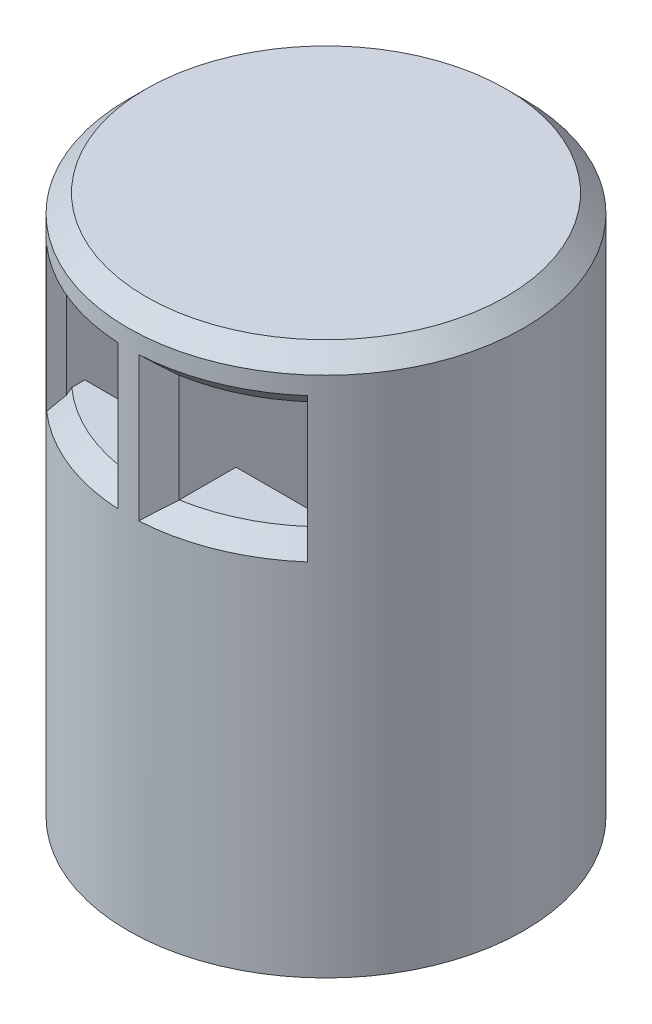
ISO-10303-21;
HEADER;
FILE_DESCRIPTION(('STEP AP214'),'2;1');
FILE_NAME('part.step','',(''),(''),'','','');
FILE_SCHEMA(('AUTOMOTIVE_DESIGN { 1 0 10303 214 1 1 1 1 }'));
ENDSEC;
DATA;
#1=APPLICATION_CONTEXT('core data for automotive mechanical design processes');
#2=APPLICATION_PROTOCOL_DEFINITION('international standard','automotive_design',2000,#1);
#3=PRODUCT_CONTEXT('',#1,'mechanical');
#4=PRODUCT('Part','Part','',(#3));
#5=PRODUCT_RELATED_PRODUCT_CATEGORY('part','',(#4));
#6=PRODUCT_DEFINITION_FORMATION('','',#4);
#7=PRODUCT_DEFINITION_CONTEXT('part definition',#1,'design');
#8=PRODUCT_DEFINITION('design','',#6,#7);
#9=PRODUCT_DEFINITION_SHAPE('','',#8);
#10=(LENGTH_UNIT() NAMED_UNIT(*) SI_UNIT(.MILLI.,.METRE.));
#11=(NAMED_UNIT(*) PLANE_ANGLE_UNIT() SI_UNIT($,.RADIAN.));
#12=(NAMED_UNIT(*) SI_UNIT($,.STERADIAN.) SOLID_ANGLE_UNIT());
#13=UNCERTAINTY_MEASURE_WITH_UNIT(LENGTH_MEASURE(1.E-05),#10,'distance_accuracy_value','');
#14=(GEOMETRIC_REPRESENTATION_CONTEXT(3) GLOBAL_UNCERTAINTY_ASSIGNED_CONTEXT((#13)) GLOBAL_UNIT_ASSIGNED_CONTEXT((#10,
#11,#12)) REPRESENTATION_CONTEXT('',''));
#15=CARTESIAN_POINT('',(0.,0.,0.));
#16=DIRECTION('',(0.,0.,1.));
#17=DIRECTION('',(1.,0.,0.));
#18=AXIS2_PLACEMENT_3D('',#15,#16,#17);
#19=CARTESIAN_POINT('',(0.,15.,0.));
#20=DIRECTION('',(0.,-1.,0.));
#21=DIRECTION('',(0.,0.,-1.));
#22=AXIS2_PLACEMENT_3D('',#19,#20,#21);
#23=CYLINDRICAL_SURFACE('',#22,5.5);
#24=CARTESIAN_POINT('',(0.,14.5,0.));
#25=DIRECTION('',(0.,1.,0.));
#26=DIRECTION('',(0.,0.,1.));
#27=AXIS2_PLACEMENT_3D('',#24,#25,#26);
#28=CIRCLE('',#27,5.5);
#29=CARTESIAN_POINT('',(0.,14.5,5.5));
#30=VERTEX_POINT('',#29);
#31=EDGE_CURVE('E11',#30,#30,#28,.F.);
#32=ORIENTED_EDGE('',*,*,#31,.T.);
#33=EDGE_LOOP('',(#32));
#34=FACE_BOUND('',#33,.T.);
#35=DIRECTION('',(0.,-1.,0.));
#36=VECTOR('',#35,1.);
#37=CARTESIAN_POINT('',(-3.62462466366027,15.,4.1366769329482));
#38=LINE('',#37,#36);
#39=CARTESIAN_POINT('',(-3.62462466366026,10.,4.1366769329482));
#40=VERTEX_POINT('',#39);
#41=CARTESIAN_POINT('',(-3.62462466366026,14.,4.1366769329482));
#42=VERTEX_POINT('',#41);
#43=EDGE_CURVE('E325',#40,#42,#38,.F.);
#44=ORIENTED_EDGE('',*,*,#43,.T.);
#45=CARTESIAN_POINT('',(0.,14.,0.));
#46=DIRECTION('',(0.,-1.,0.));
#47=DIRECTION('',(0.,0.,-1.));
#48=AXIS2_PLACEMENT_3D('',#45,#46,#47);
#49=CIRCLE('',#48,5.5);
#50=CARTESIAN_POINT('',(-0.291659907801685,14.,5.49226132828556));
#51=VERTEX_POINT('',#50);
#52=EDGE_CURVE('E328',#42,#51,#49,.F.);
#53=ORIENTED_EDGE('',*,*,#52,.T.);
#54=DIRECTION('',(0.,-1.,0.));
#55=VECTOR('',#54,1.);
#56=CARTESIAN_POINT('',(-0.291659907801685,15.,5.49226132828556));
#57=LINE('',#56,#55);
#58=CARTESIAN_POINT('',(-0.291659907801685,10.,5.49226132828556));
#59=VERTEX_POINT('',#58);
#60=EDGE_CURVE('E319',#51,#59,#57,.T.);
#61=ORIENTED_EDGE('',*,*,#60,.T.);
#62=CARTESIAN_POINT('',(0.,10.,0.));
#63=DIRECTION('',(0.,-1.,0.));
#64=DIRECTION('',(0.,0.,-1.));
#65=AXIS2_PLACEMENT_3D('',#62,#63,#64);
#66=CIRCLE('',#65,5.5);
#67=EDGE_CURVE('E322',#59,#40,#66,.T.);
#68=ORIENTED_EDGE('',*,*,#67,.T.);
#69=EDGE_LOOP('',(#44,#53,#61,#68));
#70=FACE_BOUND('',#69,.T.);
#71=DIRECTION('',(0.,-1.,0.));
#72=VECTOR('',#71,1.);
#73=CARTESIAN_POINT('',(0.291659907801685,15.,5.49226132828556));
#74=LINE('',#73,#72);
#75=CARTESIAN_POINT('',(0.291659907801685,10.,5.49226132828556));
#76=VERTEX_POINT('',#75);
#77=CARTESIAN_POINT('',(0.291659907801685,14.,5.49226132828556));
#78=VERTEX_POINT('',#77);
#79=EDGE_CURVE('E312',#76,#78,#74,.F.);
#80=ORIENTED_EDGE('',*,*,#79,.T.);
#81=CARTESIAN_POINT('',(0.,14.,0.));
#82=DIRECTION('',(0.,1.,0.));
#83=DIRECTION('',(0.,0.,1.));
#84=AXIS2_PLACEMENT_3D('',#81,#82,#83);
#85=CIRCLE('',#84,5.5);
#86=CARTESIAN_POINT('',(3.62462466366027,14.,4.13667693294819));
#87=VERTEX_POINT('',#86);
#88=EDGE_CURVE('E315',#78,#87,#85,.T.);
#89=ORIENTED_EDGE('',*,*,#88,.T.);
#90=DIRECTION('',(0.,-1.,0.));
#91=VECTOR('',#90,1.);
#92=CARTESIAN_POINT('',(3.62462466366027,15.,4.1366769329482));
#93=LINE('',#92,#91);
#94=CARTESIAN_POINT('',(3.62462466366027,10.,4.13667693294819));
#95=VERTEX_POINT('',#94);
#96=EDGE_CURVE('E309',#87,#95,#93,.T.);
#97=ORIENTED_EDGE('',*,*,#96,.T.);
#98=CARTESIAN_POINT('',(0.,10.,0.));
#99=DIRECTION('',(0.,-1.,0.));
#100=DIRECTION('',(0.,0.,-1.));
#101=AXIS2_PLACEMENT_3D('',#98,#99,#100);
#102=CIRCLE('',#101,5.5);
#103=EDGE_CURVE('E306',#95,#76,#102,.T.);
#104=ORIENTED_EDGE('',*,*,#103,.T.);
#105=EDGE_LOOP('',(#80,#89,#97,#104));
#106=FACE_BOUND('',#105,.T.);
#107=CARTESIAN_POINT('',(0.,0.,0.));
#108=DIRECTION('',(0.,1.,0.));
#109=DIRECTION('',(0.,0.,1.));
#110=AXIS2_PLACEMENT_3D('',#107,#108,#109);
#111=CIRCLE('',#110,5.5);
#112=CARTESIAN_POINT('',(0.,0.,5.5));
#113=VERTEX_POINT('',#112);
#114=EDGE_CURVE('E277',#113,#113,#111,.T.);
#115=ORIENTED_EDGE('',*,*,#114,.T.);
#116=EDGE_LOOP('',(#115));
#117=FACE_BOUND('',#116,.T.);
#118=ADVANCED_FACE('F41',(#34,#70,#106,#117),#23,.T.);
#119=CARTESIAN_POINT('',(0.,15.,0.));
#120=DIRECTION('',(0.,1.,0.));
#121=DIRECTION('',(0.,0.,1.));
#122=AXIS2_PLACEMENT_3D('',#119,#120,#121);
#123=PLANE('',#122);
#124=CARTESIAN_POINT('',(0.,15.,0.));
#125=DIRECTION('',(0.,1.,0.));
#126=DIRECTION('',(0.,0.,1.));
#127=AXIS2_PLACEMENT_3D('',#124,#125,#126);
#128=CIRCLE('',#127,5.);
#129=CARTESIAN_POINT('',(0.,15.,5.));
#130=VERTEX_POINT('',#129);
#131=EDGE_CURVE('E51',#130,#130,#128,.T.);
#132=ORIENTED_EDGE('',*,*,#131,.T.);
#133=EDGE_LOOP('',(#132));
#134=FACE_BOUND('',#133,.T.);
#135=ADVANCED_FACE('F592',(#134),#123,.T.);
#136=CARTESIAN_POINT('',(0.,0.,0.));
#137=DIRECTION('',(0.,1.,0.));
#138=DIRECTION('',(0.,0.,1.));
#139=AXIS2_PLACEMENT_3D('',#136,#137,#138);
#140=PLANE('',#139);
#141=DIRECTION('',(0.,0.,-1.));
#142=VECTOR('',#141,1.);
#143=CARTESIAN_POINT('',(3.85,0.,0.));
#144=LINE('',#143,#142);
#145=CARTESIAN_POINT('',(3.85,0.,3.85));
#146=VERTEX_POINT('',#145);
#147=CARTESIAN_POINT('',(3.85,0.,-3.85));
#148=VERTEX_POINT('',#147);
#149=EDGE_CURVE('E366',#146,#148,#144,.T.);
#150=ORIENTED_EDGE('',*,*,#149,.T.);
#151=DIRECTION('',(-1.,0.,0.));
#152=VECTOR('',#151,1.);
#153=CARTESIAN_POINT('',(0.,0.,-3.85));
#154=LINE('',#153,#152);
#155=CARTESIAN_POINT('',(-3.85,0.,-3.85));
#156=VERTEX_POINT('',#155);
#157=EDGE_CURVE('E369',#148,#156,#154,.T.);
#158=ORIENTED_EDGE('',*,*,#157,.T.);
#159=DIRECTION('',(0.,0.,1.));
#160=VECTOR('',#159,1.);
#161=CARTESIAN_POINT('',(-3.85,0.,0.));
#162=LINE('',#161,#160);
#163=CARTESIAN_POINT('',(-3.85,0.,3.85));
#164=VERTEX_POINT('',#163);
#165=EDGE_CURVE('E360',#156,#164,#162,.T.);
#166=ORIENTED_EDGE('',*,*,#165,.T.);
#167=DIRECTION('',(1.,0.,0.));
#168=VECTOR('',#167,1.);
#169=CARTESIAN_POINT('',(0.,0.,3.85));
#170=LINE('',#169,#168);
#171=EDGE_CURVE('E363',#164,#146,#170,.T.);
#172=ORIENTED_EDGE('',*,*,#171,.T.);
#173=EDGE_LOOP('',(#150,#158,#166,#172));
#174=FACE_BOUND('',#173,.T.);
#175=ORIENTED_EDGE('',*,*,#114,.F.);
#176=EDGE_LOOP('',(#175));
#177=FACE_BOUND('',#176,.T.);
#178=ADVANCED_FACE('F590',(#174,#177),#140,.F.);
#179=CARTESIAN_POINT('',(3.35,3.5,3.35));
#180=DIRECTION('',(1.,0.,0.));
#181=DIRECTION('',(0.,0.,-1.));
#182=AXIS2_PLACEMENT_3D('',#179,#180,#181);
#183=PLANE('',#182);
#184=DIRECTION('',(0.,0.,-1.));
#185=VECTOR('',#184,1.);
#186=CARTESIAN_POINT('',(3.35,10.5,5.5));
#187=LINE('',#186,#185);
#188=CARTESIAN_POINT('',(3.35,10.5,3.71180549059349));
#189=VERTEX_POINT('',#188);
#190=CARTESIAN_POINT('',(3.35,10.5,3.35));
#191=VERTEX_POINT('',#190);
#192=EDGE_CURVE('E635',#189,#191,#187,.T.);
#193=ORIENTED_EDGE('',*,*,#192,.F.);
#194=CARTESIAN_POINT('',(3.35,10.5,3.71180549059349));
#195=CARTESIAN_POINT('',(3.35,10.481349898815,3.73692500065102));
#196=CARTESIAN_POINT('',(3.35,10.462647472215,3.76200532117745));
#197=CARTESIAN_POINT('',(3.35,10.4251379700077,3.81208758073464));
#198=CARTESIAN_POINT('',(3.35,10.4063308944104,3.83708951977303));
#199=CARTESIAN_POINT('',(3.35,10.3874714934084,3.86205226928793));
#200=B_SPLINE_CURVE_WITH_KNOTS('',3,(#194,#195,#196,#197,#198,#199),.UNSPECIFIED.,.F.,.F.,(4,2,
4),(0.,0.0938574938186801,0.187714978516446),.UNSPECIFIED.);
#201=CARTESIAN_POINT('',(3.35,10.3874714934084,3.86205226928793));
#202=VERTEX_POINT('',#201);
#203=EDGE_CURVE('E536',#189,#202,#200,.T.);
#204=ORIENTED_EDGE('',*,*,#203,.T.);
#205=DIRECTION('',(0.,1.,0.));
#206=VECTOR('',#205,1.);
#207=CARTESIAN_POINT('',(3.35,3.5,3.86205226928793));
#208=LINE('',#207,#206);
#209=CARTESIAN_POINT('',(3.35,13.6125285065916,3.86205226928793));
#210=VERTEX_POINT('',#209);
#211=EDGE_CURVE('E58',#202,#210,#208,.T.);
#212=ORIENTED_EDGE('',*,*,#211,.T.);
#213=CARTESIAN_POINT('',(3.35,13.6125285065916,3.86205226928793));
#214=CARTESIAN_POINT('',(3.35,13.5936691055896,3.83708951977303));
#215=CARTESIAN_POINT('',(3.35,13.5748620299923,3.81208758073464));
#216=CARTESIAN_POINT('',(3.35,13.537352527785,3.76200532117745));
#217=CARTESIAN_POINT('',(3.35,13.518650101185,3.73692500065102));
#218=CARTESIAN_POINT('',(3.35,13.5,3.71180549059349));
#219=B_SPLINE_CURVE_WITH_KNOTS('',3,(#213,#214,#215,#216,#217,#218),.UNSPECIFIED.,.F.,.F.,(4,2,
4),(0.,0.0938574846977647,0.187714978516443),.UNSPECIFIED.);
#220=CARTESIAN_POINT('',(3.35,13.5,3.71180549059349));
#221=VERTEX_POINT('',#220);
#222=EDGE_CURVE('E581',#210,#221,#219,.T.);
#223=ORIENTED_EDGE('',*,*,#222,.T.);
#224=DIRECTION('',(0.,0.,1.));
#225=VECTOR('',#224,1.);
#226=CARTESIAN_POINT('',(3.35,13.5,-3.35));
#227=LINE('',#226,#225);
#228=CARTESIAN_POINT('',(3.35,13.5,-3.35));
#229=VERTEX_POINT('',#228);
#230=EDGE_CURVE('E256',#229,#221,#227,.T.);
#231=ORIENTED_EDGE('',*,*,#230,.F.);
#232=DIRECTION('',(0.,-1.,0.));
#233=VECTOR('',#232,1.);
#234=CARTESIAN_POINT('',(3.35,3.5,-3.35));
#235=LINE('',#234,#233);
#236=CARTESIAN_POINT('',(3.35,0.499999999999997,-3.35));
#237=VERTEX_POINT('',#236);
#238=EDGE_CURVE('E273',#229,#237,#235,.T.);
#239=ORIENTED_EDGE('',*,*,#238,.T.);
#240=DIRECTION('',(0.,0.,1.));
#241=VECTOR('',#240,1.);
#242=CARTESIAN_POINT('',(3.35,0.499999999999997,3.35));
#243=LINE('',#242,#241);
#244=CARTESIAN_POINT('',(3.35,0.499999999999997,3.35));
#245=VERTEX_POINT('',#244);
#246=EDGE_CURVE('E348',#237,#245,#243,.T.);
#247=ORIENTED_EDGE('',*,*,#246,.T.);
#248=DIRECTION('',(0.,-1.,0.));
#249=VECTOR('',#248,1.);
#250=CARTESIAN_POINT('',(3.35,3.5,3.35));
#251=LINE('',#250,#249);
#252=EDGE_CURVE('E272',#191,#245,#251,.T.);
#253=ORIENTED_EDGE('',*,*,#252,.F.);
#254=EDGE_LOOP('',(#193,#204,#212,#223,#231,#239,#247,#253));
#255=FACE_BOUND('',#254,.T.);
#256=ADVANCED_FACE('F561',(#255),#183,.F.);
#257=CARTESIAN_POINT('',(-3.35,3.5,-3.35));
#258=DIRECTION('',(0.,0.,-1.));
#259=DIRECTION('',(-1.,0.,0.));
#260=AXIS2_PLACEMENT_3D('',#257,#258,#259);
#261=PLANE('',#260);
#262=DIRECTION('',(0.,-1.,0.));
#263=VECTOR('',#262,1.);
#264=CARTESIAN_POINT('',(-3.35,3.5,-3.35));
#265=LINE('',#264,#263);
#266=CARTESIAN_POINT('',(-3.35,13.5,-3.35));
#267=VERTEX_POINT('',#266);
#268=CARTESIAN_POINT('',(-3.35,0.499999999999997,-3.35));
#269=VERTEX_POINT('',#268);
#270=EDGE_CURVE('E278',#267,#269,#265,.T.);
#271=ORIENTED_EDGE('',*,*,#270,.T.);
#272=DIRECTION('',(1.,0.,0.));
#273=VECTOR('',#272,1.);
#274=CARTESIAN_POINT('',(-3.35,0.499999999999997,-3.35));
#275=LINE('',#274,#273);
#276=EDGE_CURVE('E356',#269,#237,#275,.T.);
#277=ORIENTED_EDGE('',*,*,#276,.T.);
#278=ORIENTED_EDGE('',*,*,#238,.F.);
#279=DIRECTION('',(1.,0.,0.));
#280=VECTOR('',#279,1.);
#281=CARTESIAN_POINT('',(0.85,13.5,-3.35));
#282=LINE('',#281,#280);
#283=CARTESIAN_POINT('',(0.85,13.5,-3.35));
#284=VERTEX_POINT('',#283);
#285=EDGE_CURVE('E252',#284,#229,#282,.T.);
#286=ORIENTED_EDGE('',*,*,#285,.F.);
#287=DIRECTION('',(0.,-1.,0.));
#288=VECTOR('',#287,1.);
#289=CARTESIAN_POINT('',(0.85,13.5,-3.35));
#290=LINE('',#289,#288);
#291=CARTESIAN_POINT('',(0.85,4.,-3.35));
#292=VERTEX_POINT('',#291);
#293=EDGE_CURVE('E260',#284,#292,#290,.T.);
#294=ORIENTED_EDGE('',*,*,#293,.T.);
#295=DIRECTION('',(-0.70710678118655,-0.707106781186545,0.));
#296=VECTOR('',#295,1.);
#297=CARTESIAN_POINT('',(-1.50000000000001,1.65,-3.35));
#298=LINE('',#297,#296);
#299=CARTESIAN_POINT('',(0.349999999999999,3.5,-3.35));
#300=VERTEX_POINT('',#299);
#301=EDGE_CURVE('E382',#292,#300,#298,.T.);
#302=ORIENTED_EDGE('',*,*,#301,.T.);
#303=DIRECTION('',(1.,0.,0.));
#304=VECTOR('',#303,1.);
#305=CARTESIAN_POINT('',(-3.35,3.5,-3.35));
#306=LINE('',#305,#304);
#307=CARTESIAN_POINT('',(-0.349999999999999,3.5,-3.35));
#308=VERTEX_POINT('',#307);
#309=EDGE_CURVE('E242',#308,#300,#306,.T.);
#310=ORIENTED_EDGE('',*,*,#309,.F.);
#311=DIRECTION('',(-0.70710678118655,0.707106781186545,0.));
#312=VECTOR('',#311,1.);
#313=CARTESIAN_POINT('',(-1.85000000000001,5.,-3.35));
#314=LINE('',#313,#312);
#315=CARTESIAN_POINT('',(-0.849999999999999,4.,-3.35));
#316=VERTEX_POINT('',#315);
#317=EDGE_CURVE('E379',#308,#316,#314,.T.);
#318=ORIENTED_EDGE('',*,*,#317,.T.);
#319=DIRECTION('',(0.,-1.,0.));
#320=VECTOR('',#319,1.);
#321=CARTESIAN_POINT('',(-0.849999999999999,13.5,-3.35));
#322=LINE('',#321,#320);
#323=CARTESIAN_POINT('',(-0.849999999999999,13.5,-3.35));
#324=VERTEX_POINT('',#323);
#325=EDGE_CURVE('E237',#324,#316,#322,.T.);
#326=ORIENTED_EDGE('',*,*,#325,.F.);
#327=DIRECTION('',(1.,0.,0.));
#328=VECTOR('',#327,1.);
#329=CARTESIAN_POINT('',(-3.35,13.5,-3.35));
#330=LINE('',#329,#328);
#331=EDGE_CURVE('E627',#267,#324,#330,.T.);
#332=ORIENTED_EDGE('',*,*,#331,.F.);
#333=EDGE_LOOP('',(#271,#277,#278,#286,#294,#302,#310,#318,#326,#332));
#334=FACE_BOUND('',#333,.T.);
#335=ADVANCED_FACE('F558',(#334),#261,.F.);
#336=CARTESIAN_POINT('',(-3.35,3.5,3.35));
#337=DIRECTION('',(-1.,0.,0.));
#338=DIRECTION('',(0.,0.,1.));
#339=AXIS2_PLACEMENT_3D('',#336,#337,#338);
#340=PLANE('',#339);
#341=CARTESIAN_POINT('',(-3.35,13.5,3.71180549059349));
#342=CARTESIAN_POINT('',(-3.35,13.518650101185,3.73692500065102));
#343=CARTESIAN_POINT('',(-3.35,13.537352527785,3.76200532117745));
#344=CARTESIAN_POINT('',(-3.35,13.5748620299923,3.81208758073465));
#345=CARTESIAN_POINT('',(-3.35,13.5936691055896,3.83708951977303));
#346=CARTESIAN_POINT('',(-3.35,13.6125285065916,3.86205226928793));
#347=B_SPLINE_CURVE_WITH_KNOTS('',3,(#341,#342,#343,#344,#345,#346),.UNSPECIFIED.,.F.,.F.,(4,2,
4),(0.,0.0938574938186814,0.18771497851645),.UNSPECIFIED.);
#348=CARTESIAN_POINT('',(-3.35,13.5,3.71180549059349));
#349=VERTEX_POINT('',#348);
#350=CARTESIAN_POINT('',(-3.35,13.6125285065916,3.86205226928793));
#351=VERTEX_POINT('',#350);
#352=EDGE_CURVE('E397',#349,#351,#347,.T.);
#353=ORIENTED_EDGE('',*,*,#352,.T.);
#354=DIRECTION('',(0.,-1.,0.));
#355=VECTOR('',#354,1.);
#356=CARTESIAN_POINT('',(-3.35,3.5,3.86205226928793));
#357=LINE('',#356,#355);
#358=CARTESIAN_POINT('',(-3.35,10.3874714934084,3.86205226928793));
#359=VERTEX_POINT('',#358);
#360=EDGE_CURVE('E339',#351,#359,#357,.T.);
#361=ORIENTED_EDGE('',*,*,#360,.T.);
#362=CARTESIAN_POINT('',(-3.35,10.3874714934084,3.86205226928793));
#363=CARTESIAN_POINT('',(-3.35,10.4063308944104,3.83708951977303));
#364=CARTESIAN_POINT('',(-3.35,10.4251379700076,3.81208758073465));
#365=CARTESIAN_POINT('',(-3.35,10.462647472215,3.76200532117745));
#366=CARTESIAN_POINT('',(-3.35,10.481349898815,3.73692500065102));
#367=CARTESIAN_POINT('',(-3.35,10.5,3.71180549059349));
#368=B_SPLINE_CURVE_WITH_KNOTS('',3,(#362,#363,#364,#365,#366,#367),.UNSPECIFIED.,.F.,.F.,(4,2,
4),(0.,0.0938574846977709,0.187714978516455),.UNSPECIFIED.);
#369=CARTESIAN_POINT('',(-3.35,10.5,3.71180549059349));
#370=VERTEX_POINT('',#369);
#371=EDGE_CURVE('E568',#359,#370,#368,.T.);
#372=ORIENTED_EDGE('',*,*,#371,.T.);
#373=DIRECTION('',(0.,0.,-1.));
#374=VECTOR('',#373,1.);
#375=CARTESIAN_POINT('',(-3.35,10.5,5.5));
#376=LINE('',#375,#374);
#377=CARTESIAN_POINT('',(-3.35,10.5,3.35));
#378=VERTEX_POINT('',#377);
#379=EDGE_CURVE('E218',#370,#378,#376,.T.);
#380=ORIENTED_EDGE('',*,*,#379,.T.);
#381=DIRECTION('',(0.,-1.,0.));
#382=VECTOR('',#381,1.);
#383=CARTESIAN_POINT('',(-3.35,3.5,3.35));
#384=LINE('',#383,#382);
#385=CARTESIAN_POINT('',(-3.35,0.499999999999997,3.35));
#386=VERTEX_POINT('',#385);
#387=EDGE_CURVE('E226',#378,#386,#384,.T.);
#388=ORIENTED_EDGE('',*,*,#387,.T.);
#389=DIRECTION('',(0.,0.,-1.));
#390=VECTOR('',#389,1.);
#391=CARTESIAN_POINT('',(-3.35,0.499999999999997,3.35));
#392=LINE('',#391,#390);
#393=EDGE_CURVE('E336',#386,#269,#392,.T.);
#394=ORIENTED_EDGE('',*,*,#393,.T.);
#395=ORIENTED_EDGE('',*,*,#270,.F.);
#396=DIRECTION('',(0.,0.,-1.));
#397=VECTOR('',#396,1.);
#398=CARTESIAN_POINT('',(-3.35,13.5,3.35));
#399=LINE('',#398,#397);
#400=EDGE_CURVE('E265',#349,#267,#399,.T.);
#401=ORIENTED_EDGE('',*,*,#400,.F.);
#402=EDGE_LOOP('',(#353,#361,#372,#380,#388,#394,#395,#401));
#403=FACE_BOUND('',#402,.T.);
#404=ADVANCED_FACE('F560',(#403),#340,.F.);
#405=CARTESIAN_POINT('',(-3.35,3.5,3.35));
#406=DIRECTION('',(0.,0.,1.));
#407=DIRECTION('',(1.,0.,0.));
#408=AXIS2_PLACEMENT_3D('',#405,#406,#407);
#409=PLANE('',#408);
#410=ORIENTED_EDGE('',*,*,#252,.T.);
#411=DIRECTION('',(-1.,0.,0.));
#412=VECTOR('',#411,1.);
#413=CARTESIAN_POINT('',(-3.35,0.499999999999997,3.35));
#414=LINE('',#413,#412);
#415=EDGE_CURVE('E373',#245,#386,#414,.T.);
#416=ORIENTED_EDGE('',*,*,#415,.T.);
#417=ORIENTED_EDGE('',*,*,#387,.F.);
#418=DIRECTION('',(-1.,0.,0.));
#419=VECTOR('',#418,1.);
#420=CARTESIAN_POINT('',(-3.35,10.5,3.35));
#421=LINE('',#420,#419);
#422=CARTESIAN_POINT('',(-0.85,10.5,3.35));
#423=VERTEX_POINT('',#422);
#424=EDGE_CURVE('E209',#423,#378,#421,.T.);
#425=ORIENTED_EDGE('',*,*,#424,.F.);
#426=DIRECTION('',(0.,-1.,0.));
#427=VECTOR('',#426,1.);
#428=CARTESIAN_POINT('',(-0.85,13.5,3.35));
#429=LINE('',#428,#427);
#430=CARTESIAN_POINT('',(-0.85,4.,3.35));
#431=VERTEX_POINT('',#430);
#432=EDGE_CURVE('E224',#423,#431,#429,.T.);
#433=ORIENTED_EDGE('',*,*,#432,.T.);
#434=DIRECTION('',(0.70710678118655,-0.707106781186545,0.));
#435=VECTOR('',#434,1.);
#436=CARTESIAN_POINT('',(-1.85000000000001,5.,3.35));
#437=LINE('',#436,#435);
#438=CARTESIAN_POINT('',(-0.35,3.5,3.35));
#439=VERTEX_POINT('',#438);
#440=EDGE_CURVE('E376',#431,#439,#437,.T.);
#441=ORIENTED_EDGE('',*,*,#440,.T.);
#442=DIRECTION('',(-1.,0.,0.));
#443=VECTOR('',#442,1.);
#444=CARTESIAN_POINT('',(-3.35,3.5,3.35));
#445=LINE('',#444,#443);
#446=CARTESIAN_POINT('',(0.35,3.5,3.35));
#447=VERTEX_POINT('',#446);
#448=EDGE_CURVE('E236',#447,#439,#445,.T.);
#449=ORIENTED_EDGE('',*,*,#448,.F.);
#450=DIRECTION('',(0.70710678118655,0.707106781186545,0.));
#451=VECTOR('',#450,1.);
#452=CARTESIAN_POINT('',(-1.50000000000001,1.65,3.35));
#453=LINE('',#452,#451);
#454=CARTESIAN_POINT('',(0.85,4.,3.35));
#455=VERTEX_POINT('',#454);
#456=EDGE_CURVE('E385',#447,#455,#453,.T.);
#457=ORIENTED_EDGE('',*,*,#456,.T.);
#458=DIRECTION('',(0.,-1.,0.));
#459=VECTOR('',#458,1.);
#460=CARTESIAN_POINT('',(0.85,13.5,3.35));
#461=LINE('',#460,#459);
#462=CARTESIAN_POINT('',(0.85,10.5,3.35));
#463=VERTEX_POINT('',#462);
#464=EDGE_CURVE('E261',#463,#455,#461,.T.);
#465=ORIENTED_EDGE('',*,*,#464,.F.);
#466=DIRECTION('',(-1.,0.,0.));
#467=VECTOR('',#466,1.);
#468=CARTESIAN_POINT('',(3.35,10.5,3.35));
#469=LINE('',#468,#467);
#470=EDGE_CURVE('E471',#191,#463,#469,.T.);
#471=ORIENTED_EDGE('',*,*,#470,.F.);
#472=EDGE_LOOP('',(#410,#416,#417,#425,#433,#441,#449,#457,#465,#471));
#473=FACE_BOUND('',#472,.T.);
#474=ADVANCED_FACE('F223',(#473),#409,.F.);
#475=CARTESIAN_POINT('',(0.,3.5,0.));
#476=DIRECTION('',(0.,-1.,0.));
#477=DIRECTION('',(0.,0.,-1.));
#478=AXIS2_PLACEMENT_3D('',#475,#476,#477);
#479=PLANE('',#478);
#480=ORIENTED_EDGE('',*,*,#448,.T.);
#481=DIRECTION('',(0.,0.,-1.));
#482=VECTOR('',#481,1.);
#483=CARTESIAN_POINT('',(-0.349999999999999,3.5,-3.35));
#484=LINE('',#483,#482);
#485=EDGE_CURVE('E297',#439,#308,#484,.T.);
#486=ORIENTED_EDGE('',*,*,#485,.T.);
#487=ORIENTED_EDGE('',*,*,#309,.T.);
#488=DIRECTION('',(0.,0.,1.));
#489=VECTOR('',#488,1.);
#490=CARTESIAN_POINT('',(0.35,3.5,3.35));
#491=LINE('',#490,#489);
#492=EDGE_CURVE('E294',#300,#447,#491,.T.);
#493=ORIENTED_EDGE('',*,*,#492,.T.);
#494=EDGE_LOOP('',(#480,#486,#487,#493));
#495=FACE_BOUND('',#494,.T.);
#496=ADVANCED_FACE('F553',(#495),#479,.T.);
#497=CARTESIAN_POINT('',(0.85,13.5,-3.35));
#498=DIRECTION('',(-1.,0.,0.));
#499=DIRECTION('',(0.,0.,1.));
#500=AXIS2_PLACEMENT_3D('',#497,#498,#499);
#501=PLANE('',#500);
#502=ORIENTED_EDGE('',*,*,#464,.T.);
#503=DIRECTION('',(0.,0.,-1.));
#504=VECTOR('',#503,1.);
#505=CARTESIAN_POINT('',(0.85,4.,-3.35));
#506=LINE('',#505,#504);
#507=EDGE_CURVE('E302',#455,#292,#506,.T.);
#508=ORIENTED_EDGE('',*,*,#507,.T.);
#509=ORIENTED_EDGE('',*,*,#293,.F.);
#510=DIRECTION('',(0.,0.,-1.));
#511=VECTOR('',#510,1.);
#512=CARTESIAN_POINT('',(0.85,13.5,-3.35));
#513=LINE('',#512,#511);
#514=CARTESIAN_POINT('',(0.85,13.5,4.92722031169705));
#515=VERTEX_POINT('',#514);
#516=EDGE_CURVE('E249',#515,#284,#513,.T.);
#517=ORIENTED_EDGE('',*,*,#516,.F.);
#518=CARTESIAN_POINT('',(0.85,13.5,4.92722031169705));
#519=CARTESIAN_POINT('',(0.85,13.5011005750076,4.9283371432202));
#520=CARTESIAN_POINT('',(0.85,13.5022011554905,4.92945396934762));
#521=CARTESIAN_POINT('',(0.85,13.5044023274069,4.93168761081102));
#522=CARTESIAN_POINT('',(0.85,13.5055029188404,4.93280442614699));
#523=CARTESIAN_POINT('',(0.85,13.5066035157492,4.93392123608725));
#524=B_SPLINE_CURVE_WITH_KNOTS('',3,(#518,#519,#520,#521,#522,#523),.UNSPECIFIED.,.F.,.F.,(4,2,
4),(0.,0.00470395599298583,0.00940791198597101),.UNSPECIFIED.);
#525=CARTESIAN_POINT('',(0.85,13.5066035157492,4.93392123608725));
#526=VERTEX_POINT('',#525);
#527=EDGE_CURVE('E537',#515,#526,#524,.T.);
#528=ORIENTED_EDGE('',*,*,#527,.T.);
#529=DIRECTION('',(0.,-1.,0.));
#530=VECTOR('',#529,1.);
#531=CARTESIAN_POINT('',(0.85,13.5,4.93392123608725));
#532=LINE('',#531,#530);
#533=CARTESIAN_POINT('',(0.85,10.4933964842507,4.93392123608725));
#534=VERTEX_POINT('',#533);
#535=EDGE_CURVE('E66',#526,#534,#532,.T.);
#536=ORIENTED_EDGE('',*,*,#535,.T.);
#537=CARTESIAN_POINT('',(0.85,10.4933964842507,4.93392123608725));
#538=CARTESIAN_POINT('',(0.85,10.4944970811596,4.93280442614699));
#539=CARTESIAN_POINT('',(0.85,10.4955976725931,4.93168761081102));
#540=CARTESIAN_POINT('',(0.85,10.4977988445095,4.92945396934762));
#541=CARTESIAN_POINT('',(0.85,10.4988994249924,4.92833714322019));
#542=CARTESIAN_POINT('',(0.85,10.5,4.92722031169705));
#543=B_SPLINE_CURVE_WITH_KNOTS('',3,(#537,#538,#539,#540,#541,#542),.UNSPECIFIED.,.F.,.F.,(4,2,
4),(0.,0.00470395599298763,0.00940791198597591),.UNSPECIFIED.);
#544=CARTESIAN_POINT('',(0.85,10.5,4.92722031169705));
#545=VERTEX_POINT('',#544);
#546=EDGE_CURVE('E528',#534,#545,#543,.T.);
#547=ORIENTED_EDGE('',*,*,#546,.T.);
#548=DIRECTION('',(0.,0.,-1.));
#549=VECTOR('',#548,1.);
#550=CARTESIAN_POINT('',(0.85,10.5,5.5));
#551=LINE('',#550,#549);
#552=EDGE_CURVE('E228',#545,#463,#551,.T.);
#553=ORIENTED_EDGE('',*,*,#552,.T.);
#554=EDGE_LOOP('',(#502,#508,#509,#517,#528,#536,#547,#553));
#555=FACE_BOUND('',#554,.T.);
#556=ADVANCED_FACE('F548',(#555),#501,.F.);
#557=CARTESIAN_POINT('',(0.,13.5,0.));
#558=DIRECTION('',(0.,1.,0.));
#559=DIRECTION('',(0.,0.,1.));
#560=AXIS2_PLACEMENT_3D('',#557,#558,#559);
#561=PLANE('',#560);
#562=ORIENTED_EDGE('',*,*,#230,.T.);
#563=CARTESIAN_POINT('',(0.,13.5,0.));
#564=DIRECTION('',(0.,1.,0.));
#565=DIRECTION('',(0.,0.,1.));
#566=AXIS2_PLACEMENT_3D('',#563,#564,#565);
#567=CIRCLE('',#566,5.);
#568=EDGE_CURVE('E344',#221,#515,#567,.F.);
#569=ORIENTED_EDGE('',*,*,#568,.T.);
#570=ORIENTED_EDGE('',*,*,#516,.T.);
#571=ORIENTED_EDGE('',*,*,#285,.T.);
#572=EDGE_LOOP('',(#562,#569,#570,#571));
#573=FACE_BOUND('',#572,.T.);
#574=ADVANCED_FACE('F552',(#573),#561,.F.);
#575=CARTESIAN_POINT('',(-0.85,13.5,3.35));
#576=DIRECTION('',(1.,0.,0.));
#577=DIRECTION('',(0.,0.,-1.));
#578=AXIS2_PLACEMENT_3D('',#575,#576,#577);
#579=PLANE('',#578);
#580=ORIENTED_EDGE('',*,*,#325,.T.);
#581=DIRECTION('',(0.,0.,1.));
#582=VECTOR('',#581,1.);
#583=CARTESIAN_POINT('',(-0.85,4.,3.35));
#584=LINE('',#583,#582);
#585=EDGE_CURVE('E234',#316,#431,#584,.T.);
#586=ORIENTED_EDGE('',*,*,#585,.T.);
#587=ORIENTED_EDGE('',*,*,#432,.F.);
#588=DIRECTION('',(0.,0.,-1.));
#589=VECTOR('',#588,1.);
#590=CARTESIAN_POINT('',(-0.85,10.5,5.5));
#591=LINE('',#590,#589);
#592=CARTESIAN_POINT('',(-0.85,10.5,4.92722031169705));
#593=VERTEX_POINT('',#592);
#594=EDGE_CURVE('E205',#593,#423,#591,.T.);
#595=ORIENTED_EDGE('',*,*,#594,.F.);
#596=CARTESIAN_POINT('',(-0.85,10.5,4.92722031169705));
#597=CARTESIAN_POINT('',(-0.85,10.4988994249924,4.92833714322019));
#598=CARTESIAN_POINT('',(-0.85,10.4977988445095,4.92945396934762));
#599=CARTESIAN_POINT('',(-0.85,10.4955976725931,4.93168761081101));
#600=CARTESIAN_POINT('',(-0.85,10.4944970811596,4.93280442614699));
#601=CARTESIAN_POINT('',(-0.85,10.4933964842507,4.93392123608725));
#602=B_SPLINE_CURVE_WITH_KNOTS('',3,(#596,#597,#598,#599,#600,#601),.UNSPECIFIED.,.F.,.F.,(4,2,
4),(0.,0.00470395599298828,0.00940791198597591),.UNSPECIFIED.);
#603=CARTESIAN_POINT('',(-0.85,10.4933964842507,4.93392123608725));
#604=VERTEX_POINT('',#603);
#605=EDGE_CURVE('E575',#593,#604,#602,.T.);
#606=ORIENTED_EDGE('',*,*,#605,.T.);
#607=DIRECTION('',(0.,1.,0.));
#608=VECTOR('',#607,1.);
#609=CARTESIAN_POINT('',(-0.85,13.5,4.93392123608725));
#610=LINE('',#609,#608);
#611=CARTESIAN_POINT('',(-0.85,13.5066035157492,4.93392123608725));
#612=VERTEX_POINT('',#611);
#613=EDGE_CURVE('E289',#604,#612,#610,.T.);
#614=ORIENTED_EDGE('',*,*,#613,.T.);
#615=CARTESIAN_POINT('',(-0.85,13.5066035157492,4.93392123608725));
#616=CARTESIAN_POINT('',(-0.85,13.5055029188404,4.93280442614699));
#617=CARTESIAN_POINT('',(-0.85,13.5044023274069,4.93168761081102));
#618=CARTESIAN_POINT('',(-0.85,13.5022011554905,4.92945396934762));
#619=CARTESIAN_POINT('',(-0.85,13.5011005750076,4.9283371432202));
#620=CARTESIAN_POINT('',(-0.85,13.5,4.92722031169705));
#621=B_SPLINE_CURVE_WITH_KNOTS('',3,(#615,#616,#617,#618,#619,#620),.UNSPECIFIED.,.F.,.F.,(4,2,
4),(0.,0.0047039559929858,0.00940791198597163),.UNSPECIFIED.);
#622=CARTESIAN_POINT('',(-0.85,13.5,4.92722031169705));
#623=VERTEX_POINT('',#622);
#624=EDGE_CURVE('E388',#612,#623,#621,.T.);
#625=ORIENTED_EDGE('',*,*,#624,.T.);
#626=DIRECTION('',(0.,0.,1.));
#627=VECTOR('',#626,1.);
#628=CARTESIAN_POINT('',(-0.85,13.5,3.35));
#629=LINE('',#628,#627);
#630=EDGE_CURVE('E244',#324,#623,#629,.T.);
#631=ORIENTED_EDGE('',*,*,#630,.F.);
#632=EDGE_LOOP('',(#580,#586,#587,#595,#606,#614,#625,#631));
#633=FACE_BOUND('',#632,.T.);
#634=ADVANCED_FACE('F232',(#633),#579,.F.);
#635=CARTESIAN_POINT('',(0.,13.5,0.));
#636=DIRECTION('',(0.,-1.,0.));
#637=DIRECTION('',(0.,0.,-1.));
#638=AXIS2_PLACEMENT_3D('',#635,#636,#637);
#639=PLANE('',#638);
#640=ORIENTED_EDGE('',*,*,#630,.T.);
#641=CARTESIAN_POINT('',(0.,13.5,0.));
#642=DIRECTION('',(0.,-1.,0.));
#643=DIRECTION('',(0.,0.,-1.));
#644=AXIS2_PLACEMENT_3D('',#641,#642,#643);
#645=CIRCLE('',#644,5.);
#646=EDGE_CURVE('E332',#623,#349,#645,.T.);
#647=ORIENTED_EDGE('',*,*,#646,.T.);
#648=ORIENTED_EDGE('',*,*,#400,.T.);
#649=ORIENTED_EDGE('',*,*,#331,.T.);
#650=EDGE_LOOP('',(#640,#647,#648,#649));
#651=FACE_BOUND('',#650,.T.);
#652=ADVANCED_FACE('F628',(#651),#639,.T.);
#653=CARTESIAN_POINT('',(-3.35,10.5,5.5));
#654=DIRECTION('',(0.,-1.,0.));
#655=DIRECTION('',(0.,0.,-1.));
#656=AXIS2_PLACEMENT_3D('',#653,#654,#655);
#657=PLANE('',#656);
#658=ORIENTED_EDGE('',*,*,#379,.F.);
#659=CARTESIAN_POINT('',(0.,10.5,0.));
#660=DIRECTION('',(0.,-1.,0.));
#661=DIRECTION('',(0.,0.,-1.));
#662=AXIS2_PLACEMENT_3D('',#659,#660,#661);
#663=CIRCLE('',#662,5.);
#664=EDGE_CURVE('E212',#370,#593,#663,.F.);
#665=ORIENTED_EDGE('',*,*,#664,.T.);
#666=ORIENTED_EDGE('',*,*,#594,.T.);
#667=ORIENTED_EDGE('',*,*,#424,.T.);
#668=EDGE_LOOP('',(#658,#665,#666,#667));
#669=FACE_BOUND('',#668,.T.);
#670=ADVANCED_FACE('F208',(#669),#657,.F.);
#671=CARTESIAN_POINT('',(3.35,10.5,5.5));
#672=DIRECTION('',(0.,-1.,0.));
#673=DIRECTION('',(0.,0.,-1.));
#674=AXIS2_PLACEMENT_3D('',#671,#672,#673);
#675=PLANE('',#674);
#676=ORIENTED_EDGE('',*,*,#552,.F.);
#677=CARTESIAN_POINT('',(0.,10.5,0.));
#678=DIRECTION('',(0.,-1.,0.));
#679=DIRECTION('',(0.,0.,-1.));
#680=AXIS2_PLACEMENT_3D('',#677,#678,#679);
#681=CIRCLE('',#680,5.);
#682=EDGE_CURVE('E353',#545,#189,#681,.F.);
#683=ORIENTED_EDGE('',*,*,#682,.T.);
#684=ORIENTED_EDGE('',*,*,#192,.T.);
#685=ORIENTED_EDGE('',*,*,#470,.T.);
#686=EDGE_LOOP('',(#676,#683,#684,#685));
#687=FACE_BOUND('',#686,.T.);
#688=ADVANCED_FACE('F607',(#687),#675,.F.);
#689=CARTESIAN_POINT('',(-0.85,4.,3.35));
#690=DIRECTION('',(-0.707106781186545,-0.70710678118655,0.));
#691=DIRECTION('',(0.,0.,-1.));
#692=AXIS2_PLACEMENT_3D('',#689,#690,#691);
#693=PLANE('',#692);
#694=ORIENTED_EDGE('',*,*,#317,.F.);
#695=ORIENTED_EDGE('',*,*,#485,.F.);
#696=ORIENTED_EDGE('',*,*,#440,.F.);
#697=ORIENTED_EDGE('',*,*,#585,.F.);
#698=EDGE_LOOP('',(#694,#695,#696,#697));
#699=FACE_BOUND('',#698,.T.);
#700=ADVANCED_FACE('F603',(#699),#693,.T.);
#701=CARTESIAN_POINT('',(0.85,4.,-3.35));
#702=DIRECTION('',(0.707106781186545,-0.70710678118655,0.));
#703=DIRECTION('',(0.,0.,1.));
#704=AXIS2_PLACEMENT_3D('',#701,#702,#703);
#705=PLANE('',#704);
#706=ORIENTED_EDGE('',*,*,#456,.F.);
#707=ORIENTED_EDGE('',*,*,#492,.F.);
#708=ORIENTED_EDGE('',*,*,#301,.F.);
#709=ORIENTED_EDGE('',*,*,#507,.F.);
#710=EDGE_LOOP('',(#706,#707,#708,#709));
#711=FACE_BOUND('',#710,.T.);
#712=ADVANCED_FACE('F421',(#711),#705,.T.);
#713=CARTESIAN_POINT('',(0.,10.,0.));
#714=DIRECTION('',(0.,-1.,0.));
#715=DIRECTION('',(0.,0.,-1.));
#716=AXIS2_PLACEMENT_3D('',#713,#714,#715);
#717=CONICAL_SURFACE('',#716,5.5,0.785398163397452);
#718=ORIENTED_EDGE('',*,*,#664,.F.);
#719=ORIENTED_EDGE('',*,*,#371,.F.);
#720=CARTESIAN_POINT('',(-3.35,10.3874714934084,3.86205226928793));
#721=CARTESIAN_POINT('',(-3.39577468205151,10.3228984462688,3.90782695133944));
#722=CARTESIAN_POINT('',(-3.44154741171715,10.2583226315795,3.95359968100508));
#723=CARTESIAN_POINT('',(-3.53308896627057,10.12916546711,4.0451412355585));
#724=CARTESIAN_POINT('',(-3.57885779115835,10.0645841173299,4.09091006044629));
#725=CARTESIAN_POINT('',(-3.62462466366026,10.,4.1366769329482));
#726=B_SPLINE_CURVE_WITH_KNOTS('',3,(#720,#721,#722,#723,#724,#725),.UNSPECIFIED.,.F.,.F.,(4,2,
4),(0.,0.274304379556498,0.548608759076378),.UNSPECIFIED.);
#727=EDGE_CURVE('E463',#40,#359,#726,.F.);
#728=ORIENTED_EDGE('',*,*,#727,.F.);
#729=ORIENTED_EDGE('',*,*,#67,.F.);
#730=CARTESIAN_POINT('',(-0.85,10.4933964842507,4.93392123608725));
#731=CARTESIAN_POINT('',(-0.802457965537758,10.4546127992989,4.98146327054949));
#732=CARTESIAN_POINT('',(-0.75519222195982,10.4151573646486,5.02872901412743));
#733=CARTESIAN_POINT('',(-0.661188793199554,10.3350472778605,5.12273244288769));
#734=CARTESIAN_POINT('',(-0.614450967927925,10.2943929547181,5.16947026815932));
#735=CARTESIAN_POINT('',(-0.521454865834787,10.2120097549835,5.26246637025246));
#736=CARTESIAN_POINT('',(-0.475196570242942,10.1702809206756,5.30872466584431));
#737=CARTESIAN_POINT('',(-0.383110603744157,10.0858446623684,5.40081063234309));
#738=CARTESIAN_POINT('',(-0.337283053327616,10.0431369754098,5.44663818275963));
#739=CARTESIAN_POINT('',(-0.291659907801685,10.,5.49226132828556));
#740=B_SPLINE_CURVE_WITH_KNOTS('',3,(#730,#731,#732,#733,#734,#735,#736,#737,#738,#739),
.UNSPECIFIED.,.F.,.F.,(4,2,2,2,4),(0.,0.23284820623203,0.465633098922804,0.698408844992758,
0.931247874458221),.UNSPECIFIED.);
#741=EDGE_CURVE('E444',#604,#59,#740,.T.);
#742=ORIENTED_EDGE('',*,*,#741,.F.);
#743=ORIENTED_EDGE('',*,*,#605,.F.);
#744=EDGE_LOOP('',(#718,#719,#728,#729,#742,#743));
#745=FACE_BOUND('',#744,.T.);
#746=ADVANCED_FACE('F458',(#745),#717,.T.);
#747=CARTESIAN_POINT('',(-3.62462466366026,15.,4.1366769329482));
#748=DIRECTION('',(0.707106781186551,0.,0.707106781186544));
#749=DIRECTION('',(0.,-1.,0.));
#750=AXIS2_PLACEMENT_3D('',#747,#748,#749);
#751=PLANE('',#750);
#752=ORIENTED_EDGE('',*,*,#360,.F.);
#753=CARTESIAN_POINT('',(-3.35,13.6125285065916,3.86205226928793));
#754=CARTESIAN_POINT('',(-3.39577468205151,13.6771015537312,3.90782695133944));
#755=CARTESIAN_POINT('',(-3.44154741171715,13.7416773684205,3.95359968100508));
#756=CARTESIAN_POINT('',(-3.53308896627057,13.87083453289,4.0451412355585));
#757=CARTESIAN_POINT('',(-3.57885779115835,13.9354158826701,4.09091006044629));
#758=CARTESIAN_POINT('',(-3.62462466366026,14.,4.1366769329482));
#759=B_SPLINE_CURVE_WITH_KNOTS('',3,(#753,#754,#755,#756,#757,#758),.UNSPECIFIED.,.F.,.F.,(4,2,
4),(0.,0.274304379556498,0.548608759076379),.UNSPECIFIED.);
#760=EDGE_CURVE('E436',#42,#351,#759,.F.);
#761=ORIENTED_EDGE('',*,*,#760,.F.);
#762=ORIENTED_EDGE('',*,*,#43,.F.);
#763=ORIENTED_EDGE('',*,*,#727,.T.);
#764=EDGE_LOOP('',(#752,#761,#762,#763));
#765=FACE_BOUND('',#764,.T.);
#766=ADVANCED_FACE('F452',(#765),#751,.T.);
#767=CARTESIAN_POINT('',(-0.291659907801685,15.,5.49226132828556));
#768=DIRECTION('',(0.707106781186548,0.,-0.707106781186547));
#769=DIRECTION('',(0.,-1.,0.));
#770=AXIS2_PLACEMENT_3D('',#767,#768,#769);
#771=PLANE('',#770);
#772=ORIENTED_EDGE('',*,*,#741,.T.);
#773=ORIENTED_EDGE('',*,*,#60,.F.);
#774=CARTESIAN_POINT('',(-0.291659907801685,14.,5.49226132828556));
#775=CARTESIAN_POINT('',(-0.337283053327616,13.9568630245902,5.44663818275963));
#776=CARTESIAN_POINT('',(-0.383110603744157,13.9141553376316,5.40081063234309));
#777=CARTESIAN_POINT('',(-0.475196570242942,13.8297190793244,5.30872466584431));
#778=CARTESIAN_POINT('',(-0.521454865834787,13.7879902450165,5.26246637025246));
#779=CARTESIAN_POINT('',(-0.614450967927926,13.7056070452819,5.16947026815932));
#780=CARTESIAN_POINT('',(-0.661188793199555,13.6649527221395,5.12273244288769));
#781=CARTESIAN_POINT('',(-0.755192221959821,13.5848426353514,5.02872901412743));
#782=CARTESIAN_POINT('',(-0.802457965537759,13.5453872007011,4.98146327054949));
#783=CARTESIAN_POINT('',(-0.850000000000001,13.5066035157492,4.93392123608725));
#784=B_SPLINE_CURVE_WITH_KNOTS('',3,(#774,#775,#776,#777,#778,#779,#780,#781,#782,#783),
.UNSPECIFIED.,.F.,.F.,(4,2,2,2,4),(0.,0.232839029465463,0.465614775535418,0.698399668226195,
0.931247874458221),.UNSPECIFIED.);
#785=EDGE_CURVE('E428',#612,#51,#784,.F.);
#786=ORIENTED_EDGE('',*,*,#785,.F.);
#787=ORIENTED_EDGE('',*,*,#613,.F.);
#788=EDGE_LOOP('',(#772,#773,#786,#787));
#789=FACE_BOUND('',#788,.T.);
#790=ADVANCED_FACE('F418',(#789),#771,.F.);
#791=CARTESIAN_POINT('',(0.,14.,0.));
#792=DIRECTION('',(0.,1.,0.));
#793=DIRECTION('',(0.,0.,1.));
#794=AXIS2_PLACEMENT_3D('',#791,#792,#793);
#795=CONICAL_SURFACE('',#794,5.5,0.78539816339745);
#796=ORIENTED_EDGE('',*,*,#352,.F.);
#797=ORIENTED_EDGE('',*,*,#646,.F.);
#798=ORIENTED_EDGE('',*,*,#624,.F.);
#799=ORIENTED_EDGE('',*,*,#785,.T.);
#800=ORIENTED_EDGE('',*,*,#52,.F.);
#801=ORIENTED_EDGE('',*,*,#760,.T.);
#802=EDGE_LOOP('',(#796,#797,#798,#799,#800,#801));
#803=FACE_BOUND('',#802,.T.);
#804=ADVANCED_FACE('F408',(#803),#795,.T.);
#805=CARTESIAN_POINT('',(0.,10.,0.));
#806=DIRECTION('',(0.,-1.,0.));
#807=DIRECTION('',(0.,0.,-1.));
#808=AXIS2_PLACEMENT_3D('',#805,#806,#807);
#809=CONICAL_SURFACE('',#808,5.5,0.78539816339745);
#810=ORIENTED_EDGE('',*,*,#682,.F.);
#811=ORIENTED_EDGE('',*,*,#546,.F.);
#812=CARTESIAN_POINT('',(0.85,10.4933964842507,4.93392123608725));
#813=CARTESIAN_POINT('',(0.802457965537758,10.4546127992989,4.98146327054949));
#814=CARTESIAN_POINT('',(0.75519222195982,10.4151573646486,5.02872901412743));
#815=CARTESIAN_POINT('',(0.661188793199553,10.3350472778605,5.1227324428877));
#816=CARTESIAN_POINT('',(0.614450967927924,10.2943929547181,5.16947026815932));
#817=CARTESIAN_POINT('',(0.521454865834786,10.2120097549835,5.26246637025246));
#818=CARTESIAN_POINT('',(0.475196570242941,10.1702809206756,5.30872466584431));
#819=CARTESIAN_POINT('',(0.383110603744156,10.0858446623684,5.40081063234309));
#820=CARTESIAN_POINT('',(0.337283053327615,10.0431369754098,5.44663818275963));
#821=CARTESIAN_POINT('',(0.291659907801684,10.,5.49226132828556));
#822=B_SPLINE_CURVE_WITH_KNOTS('',3,(#812,#813,#814,#815,#816,#817,#818,#819,#820,#821),
.UNSPECIFIED.,.F.,.F.,(4,2,2,2,4),(0.,0.23284820623203,0.465633098922804,0.698408844992761,
0.931247874458221),.UNSPECIFIED.);
#823=EDGE_CURVE('E509',#76,#534,#822,.F.);
#824=ORIENTED_EDGE('',*,*,#823,.F.);
#825=ORIENTED_EDGE('',*,*,#103,.F.);
#826=CARTESIAN_POINT('',(3.62462466366027,10.,4.13667693294819));
#827=CARTESIAN_POINT('',(3.57885779115836,10.0645841173299,4.09091006044628));
#828=CARTESIAN_POINT('',(3.53308896627057,10.12916546711,4.0451412355585));
#829=CARTESIAN_POINT('',(3.44154741171715,10.2583226315795,3.95359968100508));
#830=CARTESIAN_POINT('',(3.39577468205151,10.3228984462688,3.90782695133944));
#831=CARTESIAN_POINT('',(3.35,10.3874714934084,3.86205226928793));
#832=B_SPLINE_CURVE_WITH_KNOTS('',3,(#826,#827,#828,#829,#830,#831),.UNSPECIFIED.,.F.,.F.,(4,2,
4),(0.,0.274304379519884,0.548608759076384),.UNSPECIFIED.);
#833=EDGE_CURVE('E502',#202,#95,#832,.F.);
#834=ORIENTED_EDGE('',*,*,#833,.F.);
#835=ORIENTED_EDGE('',*,*,#203,.F.);
#836=EDGE_LOOP('',(#810,#811,#824,#825,#834,#835));
#837=FACE_BOUND('',#836,.T.);
#838=ADVANCED_FACE('F417',(#837),#809,.T.);
#839=CARTESIAN_POINT('',(0.291659907801685,15.,5.49226132828556));
#840=DIRECTION('',(0.707106781186548,0.,0.707106781186547));
#841=DIRECTION('',(0.,-1.,0.));
#842=AXIS2_PLACEMENT_3D('',#839,#840,#841);
#843=PLANE('',#842);
#844=ORIENTED_EDGE('',*,*,#535,.F.);
#845=CARTESIAN_POINT('',(0.85,13.5066035157492,4.93392123608725));
#846=CARTESIAN_POINT('',(0.802457965537758,13.5453872007011,4.98146327054949));
#847=CARTESIAN_POINT('',(0.75519222195982,13.5848426353514,5.02872901412743));
#848=CARTESIAN_POINT('',(0.661188793199553,13.6649527221395,5.12273244288769));
#849=CARTESIAN_POINT('',(0.614450967927925,13.7056070452819,5.16947026815932));
#850=CARTESIAN_POINT('',(0.521454865834787,13.7879902450165,5.26246637025246));
#851=CARTESIAN_POINT('',(0.475196570242941,13.8297190793244,5.30872466584431));
#852=CARTESIAN_POINT('',(0.383110603744156,13.9141553376316,5.40081063234309));
#853=CARTESIAN_POINT('',(0.337283053327615,13.9568630245902,5.44663818275963));
#854=CARTESIAN_POINT('',(0.291659907801685,14.,5.49226132828556));
#855=B_SPLINE_CURVE_WITH_KNOTS('',3,(#845,#846,#847,#848,#849,#850,#851,#852,#853,#854),
.UNSPECIFIED.,.F.,.F.,(4,2,2,2,4),(0.,0.232848206232029,0.465633098922804,0.69840884499276,
0.931247874458221),.UNSPECIFIED.);
#856=EDGE_CURVE('E480',#78,#526,#855,.F.);
#857=ORIENTED_EDGE('',*,*,#856,.F.);
#858=ORIENTED_EDGE('',*,*,#79,.F.);
#859=ORIENTED_EDGE('',*,*,#823,.T.);
#860=EDGE_LOOP('',(#844,#857,#858,#859));
#861=FACE_BOUND('',#860,.T.);
#862=ADVANCED_FACE('F498',(#861),#843,.T.);
#863=CARTESIAN_POINT('',(3.62462466366027,15.,4.13667693294819));
#864=DIRECTION('',(0.707106781186547,0.,-0.707106781186547));
#865=DIRECTION('',(0.,-1.,0.));
#866=AXIS2_PLACEMENT_3D('',#863,#864,#865);
#867=PLANE('',#866);
#868=ORIENTED_EDGE('',*,*,#833,.T.);
#869=ORIENTED_EDGE('',*,*,#96,.F.);
#870=CARTESIAN_POINT('',(3.62462466366027,14.,4.13667693294819));
#871=CARTESIAN_POINT('',(3.57885779115836,13.9354158826701,4.09091006044628));
#872=CARTESIAN_POINT('',(3.53308896627057,13.87083453289,4.0451412355585));
#873=CARTESIAN_POINT('',(3.44154741171715,13.7416773684205,3.95359968100508));
#874=CARTESIAN_POINT('',(3.39577468205151,13.6771015537312,3.90782695133944));
#875=CARTESIAN_POINT('',(3.35,13.6125285065916,3.86205226928793));
#876=B_SPLINE_CURVE_WITH_KNOTS('',3,(#870,#871,#872,#873,#874,#875),.UNSPECIFIED.,.F.,.F.,(4,2,
4),(0.,0.274304379519885,0.548608759076384),.UNSPECIFIED.);
#877=EDGE_CURVE('E472',#210,#87,#876,.F.);
#878=ORIENTED_EDGE('',*,*,#877,.F.);
#879=ORIENTED_EDGE('',*,*,#211,.F.);
#880=EDGE_LOOP('',(#868,#869,#878,#879));
#881=FACE_BOUND('',#880,.T.);
#882=ADVANCED_FACE('F492',(#881),#867,.F.);
#883=CARTESIAN_POINT('',(0.,14.,0.));
#884=DIRECTION('',(0.,1.,0.));
#885=DIRECTION('',(0.,0.,1.));
#886=AXIS2_PLACEMENT_3D('',#883,#884,#885);
#887=CONICAL_SURFACE('',#886,5.5,0.785398163397451);
#888=ORIENTED_EDGE('',*,*,#527,.F.);
#889=ORIENTED_EDGE('',*,*,#568,.F.);
#890=ORIENTED_EDGE('',*,*,#222,.F.);
#891=ORIENTED_EDGE('',*,*,#877,.T.);
#892=ORIENTED_EDGE('',*,*,#88,.F.);
#893=ORIENTED_EDGE('',*,*,#856,.T.);
#894=EDGE_LOOP('',(#888,#889,#890,#891,#892,#893));
#895=FACE_BOUND('',#894,.T.);
#896=ADVANCED_FACE('F489',(#895),#887,.T.);
#897=CARTESIAN_POINT('',(-3.35,0.499999999999997,3.35));
#898=DIRECTION('',(0.,0.70710678118655,0.707106781186545));
#899=DIRECTION('',(-1.,0.,0.));
#900=AXIS2_PLACEMENT_3D('',#897,#898,#899);
#901=PLANE('',#900);
#902=DIRECTION('',(0.577350269189627,-0.577350269189623,0.577350269189627));
#903=VECTOR('',#902,1.);
#904=CARTESIAN_POINT('',(3.35,0.499999999999997,3.35));
#905=LINE('',#904,#903);
#906=EDGE_CURVE('E668',#146,#245,#905,.F.);
#907=ORIENTED_EDGE('',*,*,#906,.F.);
#908=ORIENTED_EDGE('',*,*,#171,.F.);
#909=DIRECTION('',(-0.577350269189627,-0.577350269189623,0.577350269189627));
#910=VECTOR('',#909,1.);
#911=CARTESIAN_POINT('',(-3.35,0.499999999999997,3.35));
#912=LINE('',#911,#910);
#913=EDGE_CURVE('E481',#386,#164,#912,.T.);
#914=ORIENTED_EDGE('',*,*,#913,.F.);
#915=ORIENTED_EDGE('',*,*,#415,.F.);
#916=EDGE_LOOP('',(#907,#908,#914,#915));
#917=FACE_BOUND('',#916,.T.);
#918=ADVANCED_FACE('F686',(#917),#901,.F.);
#919=CARTESIAN_POINT('',(-3.35,0.499999999999997,3.35));
#920=DIRECTION('',(-0.707106781186545,0.70710678118655,0.));
#921=DIRECTION('',(0.,0.,-1.));
#922=AXIS2_PLACEMENT_3D('',#919,#920,#921);
#923=PLANE('',#922);
#924=ORIENTED_EDGE('',*,*,#913,.T.);
#925=ORIENTED_EDGE('',*,*,#165,.F.);
#926=DIRECTION('',(0.577350269189627,0.577350269189623,0.577350269189627));
#927=VECTOR('',#926,1.);
#928=CARTESIAN_POINT('',(-3.35,0.499999999999997,-3.35));
#929=LINE('',#928,#927);
#930=EDGE_CURVE('E662',#269,#156,#929,.F.);
#931=ORIENTED_EDGE('',*,*,#930,.F.);
#932=ORIENTED_EDGE('',*,*,#393,.F.);
#933=EDGE_LOOP('',(#924,#925,#931,#932));
#934=FACE_BOUND('',#933,.T.);
#935=ADVANCED_FACE('F664',(#934),#923,.F.);
#936=CARTESIAN_POINT('',(3.35,0.499999999999997,3.35));
#937=DIRECTION('',(0.707106781186545,0.70710678118655,0.));
#938=DIRECTION('',(0.,0.,1.));
#939=AXIS2_PLACEMENT_3D('',#936,#937,#938);
#940=PLANE('',#939);
#941=ORIENTED_EDGE('',*,*,#906,.T.);
#942=ORIENTED_EDGE('',*,*,#246,.F.);
#943=DIRECTION('',(0.577350269189627,-0.577350269189623,-0.577350269189627));
#944=VECTOR('',#943,1.);
#945=CARTESIAN_POINT('',(1.11666666666666,2.73333333333333,-1.11666666666666));
#946=LINE('',#945,#944);
#947=EDGE_CURVE('E669',#148,#237,#946,.F.);
#948=ORIENTED_EDGE('',*,*,#947,.F.);
#949=ORIENTED_EDGE('',*,*,#149,.F.);
#950=EDGE_LOOP('',(#941,#942,#948,#949));
#951=FACE_BOUND('',#950,.T.);
#952=ADVANCED_FACE('F677',(#951),#940,.F.);
#953=CARTESIAN_POINT('',(-3.35,0.499999999999997,-3.35));
#954=DIRECTION('',(0.,0.70710678118655,-0.707106781186545));
#955=DIRECTION('',(1.,0.,0.));
#956=AXIS2_PLACEMENT_3D('',#953,#954,#955);
#957=PLANE('',#956);
#958=ORIENTED_EDGE('',*,*,#930,.T.);
#959=ORIENTED_EDGE('',*,*,#157,.F.);
#960=ORIENTED_EDGE('',*,*,#947,.T.);
#961=ORIENTED_EDGE('',*,*,#276,.F.);
#962=EDGE_LOOP('',(#958,#959,#960,#961));
#963=FACE_BOUND('',#962,.T.);
#964=ADVANCED_FACE('F522',(#963),#957,.F.);
#965=CARTESIAN_POINT('',(0.,15.,0.));
#966=DIRECTION('',(0.,-1.,0.));
#967=DIRECTION('',(0.,0.,-1.));
#968=AXIS2_PLACEMENT_3D('',#965,#966,#967);
#969=CONICAL_SURFACE('',#968,5.,0.785398163397447);
#970=ORIENTED_EDGE('',*,*,#31,.F.);
#971=EDGE_LOOP('',(#970));
#972=FACE_BOUND('',#971,.T.);
#973=ORIENTED_EDGE('',*,*,#131,.F.);
#974=EDGE_LOOP('',(#973));
#975=FACE_BOUND('',#974,.T.);
#976=ADVANCED_FACE('F44',(#972,#975),#969,.T.);
#977=CLOSED_SHELL('',(#118,#135,#178,#256,#335,#404,#474,#496,#556,#574,#634,#652,#670,#688,
#700,#712,#746,#766,#790,#804,#838,#862,#882,#896,#918,#935,#952,#964,#976));
#978=MANIFOLD_SOLID_BREP('B2',#977);
#979=ADVANCED_BREP_SHAPE_REPRESENTATION('',(#18,#978),#14);
#980=SHAPE_DEFINITION_REPRESENTATION(#9,#979);
ENDSEC;
END-ISO-10303-21;
